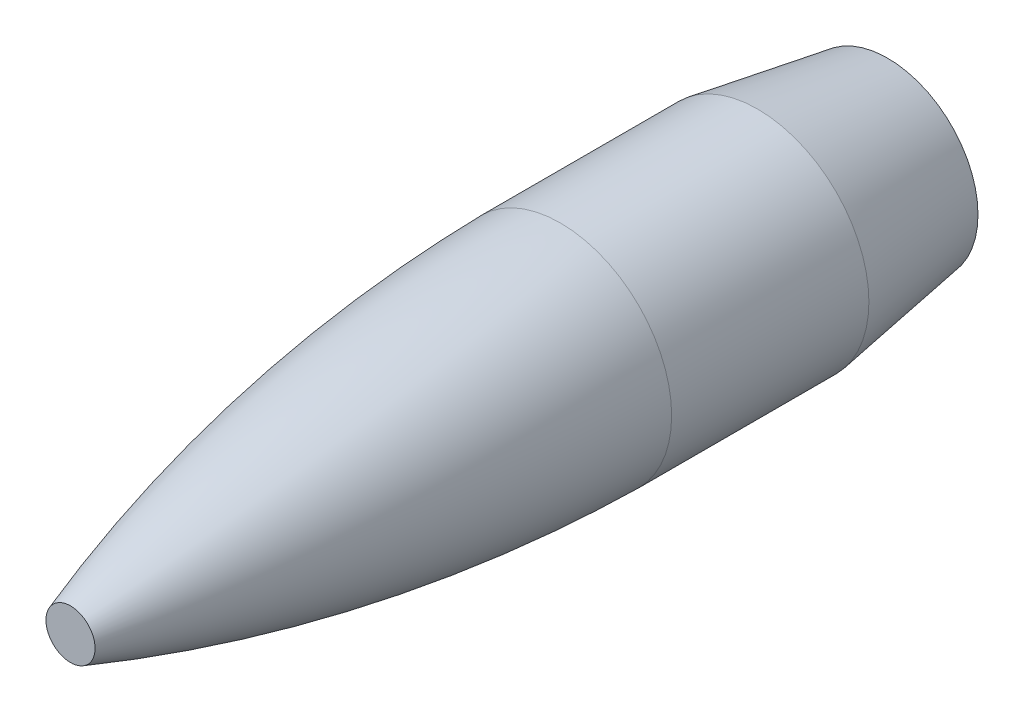
ISO-10303-21;
HEADER;
FILE_DESCRIPTION(('STEP AP214'),'2;1');
FILE_NAME('part.step','',(''),(''),'','','');
FILE_SCHEMA(('AUTOMOTIVE_DESIGN { 1 0 10303 214 1 1 1 1 }'));
ENDSEC;
DATA;
#1=APPLICATION_CONTEXT('core data for automotive mechanical design processes');
#2=APPLICATION_PROTOCOL_DEFINITION('international standard','automotive_design',2000,#1);
#3=PRODUCT_CONTEXT('',#1,'mechanical');
#4=PRODUCT('Part','Part','',(#3));
#5=PRODUCT_RELATED_PRODUCT_CATEGORY('part','',(#4));
#6=PRODUCT_DEFINITION_FORMATION('','',#4);
#7=PRODUCT_DEFINITION_CONTEXT('part definition',#1,'design');
#8=PRODUCT_DEFINITION('design','',#6,#7);
#9=PRODUCT_DEFINITION_SHAPE('','',#8);
#10=(LENGTH_UNIT() NAMED_UNIT(*) SI_UNIT(.MILLI.,.METRE.));
#11=(NAMED_UNIT(*) PLANE_ANGLE_UNIT() SI_UNIT($,.RADIAN.));
#12=(NAMED_UNIT(*) SI_UNIT($,.STERADIAN.) SOLID_ANGLE_UNIT());
#13=UNCERTAINTY_MEASURE_WITH_UNIT(LENGTH_MEASURE(1.E-05),#10,'distance_accuracy_value','');
#14=(GEOMETRIC_REPRESENTATION_CONTEXT(3) GLOBAL_UNCERTAINTY_ASSIGNED_CONTEXT((#13)) GLOBAL_UNIT_ASSIGNED_CONTEXT((#10,
#11,#12)) REPRESENTATION_CONTEXT('',''));
#15=CARTESIAN_POINT('',(0.,0.,0.));
#16=DIRECTION('',(0.,0.,1.));
#17=DIRECTION('',(1.,0.,0.));
#18=AXIS2_PLACEMENT_3D('',#15,#16,#17);
#19=CARTESIAN_POINT('',(2.00602362026964E-13,0.,28.7274));
#20=DIRECTION('',(0.,0.,1.));
#21=DIRECTION('',(1.,0.,0.));
#22=AXIS2_PLACEMENT_3D('',#19,#20,#21);
#23=PLANE('',#22);
#24=CARTESIAN_POINT('',(2.00602362026964E-13,0.,28.7274));
#25=DIRECTION('',(0.,0.,1.));
#26=DIRECTION('',(1.,0.,0.));
#27=AXIS2_PLACEMENT_3D('',#24,#25,#26);
#28=CIRCLE('',#27,0.863600000000007);
#29=CARTESIAN_POINT('',(0.863600000000207,0.,28.7274));
#30=VERTEX_POINT('',#29);
#31=EDGE_CURVE('E10',#30,#30,#28,.T.);
#32=ORIENTED_EDGE('',*,*,#31,.T.);
#33=EDGE_LOOP('',(#32));
#34=FACE_BOUND('',#33,.T.);
#35=ADVANCED_FACE('F37',(#34),#23,.T.);
#36=CARTESIAN_POINT('',(0.,0.,10.6951374301681));
#37=DIRECTION('',(0.,0.,1.));
#38=DIRECTION('',(1.,0.,0.));
#39=AXIS2_PLACEMENT_3D('',#36,#37,#38);
#40=DEGENERATE_TOROIDAL_SURFACE('',#39,50.84479351955,54.7624,.F.);
#41=CARTESIAN_POINT('',(0.,0.,11.5062));
#42=DIRECTION('',(0.,0.,1.));
#43=DIRECTION('',(1.,0.,0.));
#44=AXIS2_PLACEMENT_3D('',#41,#42,#43);
#45=CIRCLE('',#44,3.9116);
#46=CARTESIAN_POINT('',(3.91160000000008,0.,11.5062));
#47=VERTEX_POINT('',#46);
#48=EDGE_CURVE('E44',#47,#47,#45,.T.);
#49=ORIENTED_EDGE('',*,*,#48,.T.);
#50=EDGE_LOOP('',(#49));
#51=FACE_BOUND('',#50,.T.);
#52=ORIENTED_EDGE('',*,*,#31,.F.);
#53=EDGE_LOOP('',(#52));
#54=FACE_BOUND('',#53,.T.);
#55=ADVANCED_FACE('F73',(#51,#54),#40,.F.);
#56=CARTESIAN_POINT('',(2.00602362026964E-13,0.,28.7274));
#57=DIRECTION('',(0.,0.,1.));
#58=DIRECTION('',(1.,0.,0.));
#59=AXIS2_PLACEMENT_3D('',#56,#57,#58);
#60=CYLINDRICAL_SURFACE('',#59,3.9116);
#61=CARTESIAN_POINT('',(0.,0.,4.572));
#62=DIRECTION('',(0.,0.,1.));
#63=DIRECTION('',(1.,0.,0.));
#64=AXIS2_PLACEMENT_3D('',#61,#62,#63);
#65=CIRCLE('',#64,3.9116);
#66=CARTESIAN_POINT('',(3.91160000000003,0.,4.57199999999997));
#67=VERTEX_POINT('',#66);
#68=EDGE_CURVE('E49',#67,#67,#65,.T.);
#69=ORIENTED_EDGE('',*,*,#68,.T.);
#70=EDGE_LOOP('',(#69));
#71=FACE_BOUND('',#70,.T.);
#72=ORIENTED_EDGE('',*,*,#48,.F.);
#73=EDGE_LOOP('',(#72));
#74=FACE_BOUND('',#73,.T.);
#75=ADVANCED_FACE('F70',(#71,#74),#60,.T.);
#76=CARTESIAN_POINT('',(0.,0.,4.572));
#77=DIRECTION('',(0.,0.,1.));
#78=DIRECTION('',(1.,0.,0.));
#79=AXIS2_PLACEMENT_3D('',#76,#77,#78);
#80=CONICAL_SURFACE('',#79,3.9116,0.159738450670912);
#81=CARTESIAN_POINT('',(0.,0.,0.));
#82=DIRECTION('',(0.,0.,1.));
#83=DIRECTION('',(1.,0.,0.));
#84=AXIS2_PLACEMENT_3D('',#81,#82,#83);
#85=CIRCLE('',#84,3.175);
#86=CARTESIAN_POINT('',(3.175,0.,0.));
#87=VERTEX_POINT('',#86);
#88=EDGE_CURVE('E54',#87,#87,#85,.T.);
#89=ORIENTED_EDGE('',*,*,#88,.T.);
#90=EDGE_LOOP('',(#89));
#91=FACE_BOUND('',#90,.T.);
#92=ORIENTED_EDGE('',*,*,#68,.F.);
#93=EDGE_LOOP('',(#92));
#94=FACE_BOUND('',#93,.T.);
#95=ADVANCED_FACE('F61',(#91,#94),#80,.T.);
#96=CARTESIAN_POINT('',(3.175,0.,0.));
#97=DIRECTION('',(0.,0.,-1.));
#98=DIRECTION('',(-1.,0.,0.));
#99=AXIS2_PLACEMENT_3D('',#96,#97,#98);
#100=PLANE('',#99);
#101=ORIENTED_EDGE('',*,*,#88,.F.);
#102=EDGE_LOOP('',(#101));
#103=FACE_BOUND('',#102,.T.);
#104=ADVANCED_FACE('F64',(#103),#100,.T.);
#105=CLOSED_SHELL('',(#35,#55,#75,#95,#104));
#106=MANIFOLD_SOLID_BREP('B2',#105);
#107=ADVANCED_BREP_SHAPE_REPRESENTATION('',(#18,#106),#14);
#108=SHAPE_DEFINITION_REPRESENTATION(#9,#107);
ENDSEC;
END-ISO-10303-21;
